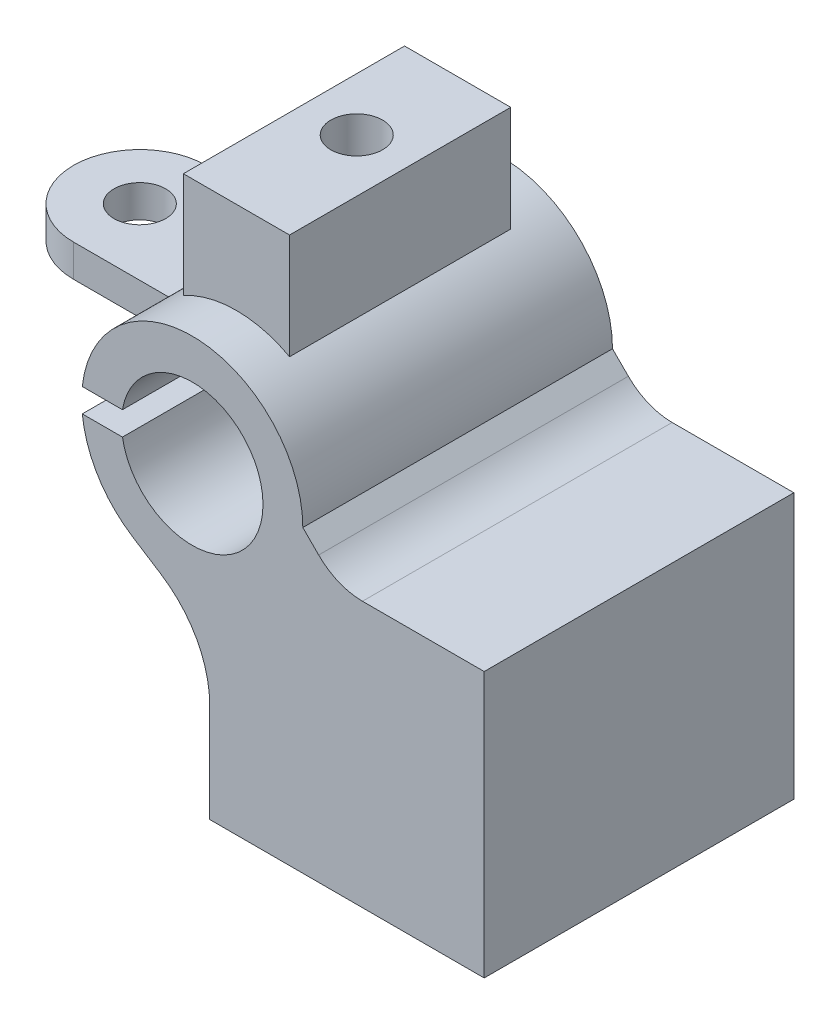
ISO-10303-21;
HEADER;
FILE_DESCRIPTION(('STEP AP214'),'2;1');
FILE_NAME('part.step','',(''),(''),'','','');
FILE_SCHEMA(('AUTOMOTIVE_DESIGN { 1 0 10303 214 1 1 1 1 }'));
ENDSEC;
DATA;
#1=APPLICATION_CONTEXT('core data for automotive mechanical design processes');
#2=APPLICATION_PROTOCOL_DEFINITION('international standard','automotive_design',2000,#1);
#3=PRODUCT_CONTEXT('',#1,'mechanical');
#4=PRODUCT('Part','Part','',(#3));
#5=PRODUCT_RELATED_PRODUCT_CATEGORY('part','',(#4));
#6=PRODUCT_DEFINITION_FORMATION('','',#4);
#7=PRODUCT_DEFINITION_CONTEXT('part definition',#1,'design');
#8=PRODUCT_DEFINITION('design','',#6,#7);
#9=PRODUCT_DEFINITION_SHAPE('','',#8);
#10=(LENGTH_UNIT() NAMED_UNIT(*) SI_UNIT(.MILLI.,.METRE.));
#11=(NAMED_UNIT(*) PLANE_ANGLE_UNIT() SI_UNIT($,.RADIAN.));
#12=(NAMED_UNIT(*) SI_UNIT($,.STERADIAN.) SOLID_ANGLE_UNIT());
#13=UNCERTAINTY_MEASURE_WITH_UNIT(LENGTH_MEASURE(1.E-05),#10,'distance_accuracy_value','');
#14=(GEOMETRIC_REPRESENTATION_CONTEXT(3) GLOBAL_UNCERTAINTY_ASSIGNED_CONTEXT((#13)) GLOBAL_UNIT_ASSIGNED_CONTEXT((#10,
#11,#12)) REPRESENTATION_CONTEXT('',''));
#15=CARTESIAN_POINT('',(0.,0.,0.));
#16=DIRECTION('',(0.,0.,1.));
#17=DIRECTION('',(1.,0.,0.));
#18=AXIS2_PLACEMENT_3D('',#15,#16,#17);
#19=CARTESIAN_POINT('',(-23.4236675195478,4.98706962256978,0.));
#20=DIRECTION('',(0.,1.,0.));
#21=DIRECTION('',(0.,0.,1.));
#22=AXIS2_PLACEMENT_3D('',#19,#20,#21);
#23=CYLINDRICAL_SURFACE('',#22,7.5);
#24=DIRECTION('',(0.,1.,0.));
#25=VECTOR('',#24,1.);
#26=CARTESIAN_POINT('',(-23.4236675195478,0.,7.5));
#27=LINE('',#26,#25);
#28=CARTESIAN_POINT('',(-23.4236675195478,4.98706962256978,7.5));
#29=VERTEX_POINT('',#28);
#30=CARTESIAN_POINT('',(-23.4236675195478,1.33882947838515,7.5));
#31=VERTEX_POINT('',#30);
#32=EDGE_CURVE('E108',#29,#31,#27,.F.);
#33=ORIENTED_EDGE('',*,*,#32,.F.);
#34=CARTESIAN_POINT('',(-23.4236675195478,4.98706962256978,0.));
#35=DIRECTION('',(0.,1.,0.));
#36=DIRECTION('',(0.,0.,1.));
#37=AXIS2_PLACEMENT_3D('',#34,#35,#36);
#38=CIRCLE('',#37,7.5);
#39=CARTESIAN_POINT('',(-23.4236675195478,4.98706962256978,-7.5));
#40=VERTEX_POINT('',#39);
#41=EDGE_CURVE('E59',#40,#29,#38,.T.);
#42=ORIENTED_EDGE('',*,*,#41,.F.);
#43=DIRECTION('',(0.,-1.,0.));
#44=VECTOR('',#43,1.);
#45=CARTESIAN_POINT('',(-23.4236675195478,4.98706962256978,-7.5));
#46=LINE('',#45,#44);
#47=CARTESIAN_POINT('',(-23.4236675195478,1.33882947838515,-7.5));
#48=VERTEX_POINT('',#47);
#49=EDGE_CURVE('E126',#48,#40,#46,.F.);
#50=ORIENTED_EDGE('',*,*,#49,.F.);
#51=CARTESIAN_POINT('',(-23.4236675195478,1.33882947838515,0.));
#52=DIRECTION('',(0.,-1.,0.));
#53=DIRECTION('',(0.,0.,-1.));
#54=AXIS2_PLACEMENT_3D('',#51,#52,#53);
#55=CIRCLE('',#54,7.5);
#56=EDGE_CURVE('E12',#31,#48,#55,.T.);
#57=ORIENTED_EDGE('',*,*,#56,.F.);
#58=EDGE_LOOP('',(#33,#42,#50,#57));
#59=FACE_BOUND('',#58,.T.);
#60=ADVANCED_FACE('F51',(#59),#23,.T.);
#61=CARTESIAN_POINT('',(0.,0.,7.5));
#62=DIRECTION('',(0.,0.,-1.));
#63=DIRECTION('',(-1.,0.,0.));
#64=AXIS2_PLACEMENT_3D('',#61,#62,#63);
#65=CYLINDRICAL_SURFACE('',#64,12.5);
#66=CARTESIAN_POINT('',(0.,0.,-7.5));
#67=DIRECTION('',(0.,0.,1.));
#68=DIRECTION('',(1.,0.,0.));
#69=AXIS2_PLACEMENT_3D('',#66,#67,#68);
#70=CIRCLE('',#69,12.5);
#71=CARTESIAN_POINT('',(-11.4620738341559,4.98706962256978,-7.5));
#72=VERTEX_POINT('',#71);
#73=CARTESIAN_POINT('',(-12.4280946097061,1.33882947838515,-7.5));
#74=VERTEX_POINT('',#73);
#75=EDGE_CURVE('E107',#72,#74,#70,.T.);
#76=ORIENTED_EDGE('',*,*,#75,.F.);
#77=DIRECTION('',(0.,0.,-1.));
#78=VECTOR('',#77,1.);
#79=CARTESIAN_POINT('',(-11.4620738341559,4.98706962256978,7.5));
#80=LINE('',#79,#78);
#81=CARTESIAN_POINT('',(-11.4620738341559,4.98706962256978,7.5));
#82=VERTEX_POINT('',#81);
#83=EDGE_CURVE('E94',#82,#72,#80,.T.);
#84=ORIENTED_EDGE('',*,*,#83,.F.);
#85=CARTESIAN_POINT('',(0.,0.,7.5));
#86=DIRECTION('',(0.,0.,1.));
#87=DIRECTION('',(1.,0.,0.));
#88=AXIS2_PLACEMENT_3D('',#85,#86,#87);
#89=CIRCLE('',#88,12.5);
#90=CARTESIAN_POINT('',(-12.4280946097061,1.33882947838515,7.5));
#91=VERTEX_POINT('',#90);
#92=EDGE_CURVE('E100',#82,#91,#89,.T.);
#93=ORIENTED_EDGE('',*,*,#92,.T.);
#94=DIRECTION('',(0.,0.,-1.));
#95=VECTOR('',#94,1.);
#96=CARTESIAN_POINT('',(-12.4280946097061,1.33882947838515,7.5));
#97=LINE('',#96,#95);
#98=EDGE_CURVE('E109',#91,#74,#97,.T.);
#99=ORIENTED_EDGE('',*,*,#98,.T.);
#100=EDGE_LOOP('',(#76,#84,#93,#99));
#101=FACE_BOUND('',#100,.T.);
#102=ADVANCED_FACE('F104',(#101),#65,.F.);
#103=CARTESIAN_POINT('',(0.,4.98706962256978,7.5));
#104=DIRECTION('',(0.,1.,0.));
#105=DIRECTION('',(0.,0.,1.));
#106=AXIS2_PLACEMENT_3D('',#103,#104,#105);
#107=PLANE('',#106);
#108=CARTESIAN_POINT('',(-23.4236675195478,4.98706962256978,0.));
#109=DIRECTION('',(0.,1.,0.));
#110=DIRECTION('',(0.,0.,1.));
#111=AXIS2_PLACEMENT_3D('',#108,#109,#110);
#112=CIRCLE('',#111,2.921);
#113=CARTESIAN_POINT('',(-23.4236675195478,4.98706962256978,2.921));
#114=VERTEX_POINT('',#113);
#115=EDGE_CURVE('E191',#114,#114,#112,.T.);
#116=ORIENTED_EDGE('',*,*,#115,.F.);
#117=EDGE_LOOP('',(#116));
#118=FACE_BOUND('',#117,.T.);
#119=DIRECTION('',(1.,0.,0.));
#120=VECTOR('',#119,1.);
#121=CARTESIAN_POINT('',(0.,4.98706962256978,-7.5));
#122=LINE('',#121,#120);
#123=EDGE_CURVE('E115',#40,#72,#122,.T.);
#124=ORIENTED_EDGE('',*,*,#123,.F.);
#125=ORIENTED_EDGE('',*,*,#41,.T.);
#126=DIRECTION('',(1.,0.,0.));
#127=VECTOR('',#126,1.);
#128=CARTESIAN_POINT('',(0.,4.98706962256978,7.5));
#129=LINE('',#128,#127);
#130=EDGE_CURVE('E90',#29,#82,#129,.T.);
#131=ORIENTED_EDGE('',*,*,#130,.T.);
#132=ORIENTED_EDGE('',*,*,#83,.T.);
#133=EDGE_LOOP('',(#124,#125,#131,#132));
#134=FACE_BOUND('',#133,.T.);
#135=ADVANCED_FACE('F93',(#118,#134),#107,.T.);
#136=CARTESIAN_POINT('',(0.,1.33882947838515,7.5));
#137=DIRECTION('',(0.,-1.,0.));
#138=DIRECTION('',(0.,0.,-1.));
#139=AXIS2_PLACEMENT_3D('',#136,#137,#138);
#140=PLANE('',#139);
#141=CARTESIAN_POINT('',(-23.4236675195478,1.33882947838515,0.));
#142=DIRECTION('',(0.,-1.,0.));
#143=DIRECTION('',(0.,0.,-1.));
#144=AXIS2_PLACEMENT_3D('',#141,#142,#143);
#145=CIRCLE('',#144,2.921);
#146=CARTESIAN_POINT('',(-23.4236675195478,1.33882947838515,-2.921));
#147=VERTEX_POINT('',#146);
#148=EDGE_CURVE('E118',#147,#147,#145,.T.);
#149=ORIENTED_EDGE('',*,*,#148,.F.);
#150=EDGE_LOOP('',(#149));
#151=FACE_BOUND('',#150,.T.);
#152=DIRECTION('',(-1.,0.,0.));
#153=VECTOR('',#152,1.);
#154=CARTESIAN_POINT('',(0.,1.33882947838515,7.5));
#155=LINE('',#154,#153);
#156=EDGE_CURVE('E99',#91,#31,#155,.T.);
#157=ORIENTED_EDGE('',*,*,#156,.T.);
#158=ORIENTED_EDGE('',*,*,#56,.T.);
#159=DIRECTION('',(-1.,0.,0.));
#160=VECTOR('',#159,1.);
#161=CARTESIAN_POINT('',(0.,1.33882947838515,-7.5));
#162=LINE('',#161,#160);
#163=EDGE_CURVE('E112',#74,#48,#162,.T.);
#164=ORIENTED_EDGE('',*,*,#163,.F.);
#165=ORIENTED_EDGE('',*,*,#98,.F.);
#166=EDGE_LOOP('',(#157,#158,#164,#165));
#167=FACE_BOUND('',#166,.T.);
#168=ADVANCED_FACE('F129',(#151,#167),#140,.T.);
#169=CARTESIAN_POINT('',(0.,0.,7.5));
#170=DIRECTION('',(0.,0.,1.));
#171=DIRECTION('',(1.,0.,0.));
#172=AXIS2_PLACEMENT_3D('',#169,#170,#171);
#173=PLANE('',#172);
#174=ORIENTED_EDGE('',*,*,#130,.F.);
#175=ORIENTED_EDGE('',*,*,#32,.T.);
#176=ORIENTED_EDGE('',*,*,#156,.F.);
#177=ORIENTED_EDGE('',*,*,#92,.F.);
#178=EDGE_LOOP('',(#174,#175,#176,#177));
#179=FACE_BOUND('',#178,.T.);
#180=ADVANCED_FACE('F111',(#179),#173,.T.);
#181=CARTESIAN_POINT('',(0.,0.,-7.5));
#182=DIRECTION('',(0.,0.,1.));
#183=DIRECTION('',(1.,0.,0.));
#184=AXIS2_PLACEMENT_3D('',#181,#182,#183);
#185=PLANE('',#184);
#186=ORIENTED_EDGE('',*,*,#163,.T.);
#187=ORIENTED_EDGE('',*,*,#49,.T.);
#188=ORIENTED_EDGE('',*,*,#123,.T.);
#189=ORIENTED_EDGE('',*,*,#75,.T.);
#190=EDGE_LOOP('',(#186,#187,#188,#189));
#191=FACE_BOUND('',#190,.T.);
#192=ADVANCED_FACE('F128',(#191),#185,.F.);
#193=CARTESIAN_POINT('',(-23.4236675195478,4.98706962256978,0.));
#194=DIRECTION('',(0.,1.,0.));
#195=DIRECTION('',(0.,0.,1.));
#196=AXIS2_PLACEMENT_3D('',#193,#194,#195);
#197=CYLINDRICAL_SURFACE('',#196,2.921);
#198=ORIENTED_EDGE('',*,*,#148,.T.);
#199=EDGE_LOOP('',(#198));
#200=FACE_BOUND('',#199,.T.);
#201=ORIENTED_EDGE('',*,*,#115,.T.);
#202=EDGE_LOOP('',(#201));
#203=FACE_BOUND('',#202,.T.);
#204=ADVANCED_FACE('F167',(#200,#203),#197,.F.);
#205=CLOSED_SHELL('',(#60,#102,#135,#168,#180,#192,#204));
#206=MANIFOLD_SOLID_BREP('B2',#205);
#207=CARTESIAN_POINT('',(-10.0222889013325,-22.6745266772196,17.5));
#208=DIRECTION('',(0.,0.,-1.));
#209=DIRECTION('',(-1.,0.,0.));
#210=AXIS2_PLACEMENT_3D('',#207,#208,#209);
#211=CYLINDRICAL_SURFACE('',#210,12.);
#212=CARTESIAN_POINT('',(-10.0222889013325,-22.6745266772196,-17.5));
#213=DIRECTION('',(0.,0.,1.));
#214=DIRECTION('',(1.,0.,0.));
#215=AXIS2_PLACEMENT_3D('',#212,#213,#214);
#216=CIRCLE('',#215,12.);
#217=CARTESIAN_POINT('',(1.97771109866749,-22.6745266772197,-17.5));
#218=VERTEX_POINT('',#217);
#219=CARTESIAN_POINT('',(-3.55188890133251,-12.5683936957079,-17.5));
#220=VERTEX_POINT('',#219);
#221=EDGE_CURVE('E359',#218,#220,#216,.T.);
#222=ORIENTED_EDGE('',*,*,#221,.F.);
#223=DIRECTION('',(0.,0.,-1.));
#224=VECTOR('',#223,1.);
#225=CARTESIAN_POINT('',(1.97771109866749,-22.6745266772197,17.5));
#226=LINE('',#225,#224);
#227=CARTESIAN_POINT('',(1.97771109866749,-22.6745266772197,17.5));
#228=VERTEX_POINT('',#227);
#229=EDGE_CURVE('E49',#228,#218,#226,.T.);
#230=ORIENTED_EDGE('',*,*,#229,.F.);
#231=CARTESIAN_POINT('',(-10.0222889013325,-22.6745266772196,17.5));
#232=DIRECTION('',(0.,0.,1.));
#233=DIRECTION('',(1.,0.,0.));
#234=AXIS2_PLACEMENT_3D('',#231,#232,#233);
#235=CIRCLE('',#234,12.);
#236=CARTESIAN_POINT('',(-3.55188890133251,-12.5683936957079,17.5));
#237=VERTEX_POINT('',#236);
#238=EDGE_CURVE('E360',#228,#237,#235,.T.);
#239=ORIENTED_EDGE('',*,*,#238,.T.);
#240=DIRECTION('',(0.,0.,-1.));
#241=VECTOR('',#240,1.);
#242=CARTESIAN_POINT('',(-3.55188890133251,-12.5683936957079,17.5));
#243=LINE('',#242,#241);
#244=EDGE_CURVE('E396',#237,#220,#243,.T.);
#245=ORIENTED_EDGE('',*,*,#244,.T.);
#246=EDGE_LOOP('',(#222,#230,#239,#245));
#247=FACE_BOUND('',#246,.T.);
#248=ADVANCED_FACE('F199',(#247),#211,.F.);
#249=CARTESIAN_POINT('',(1.97771109866756,0.,17.5));
#250=DIRECTION('',(-1.,0.,0.));
#251=DIRECTION('',(0.,-1.,0.));
#252=AXIS2_PLACEMENT_3D('',#249,#250,#251);
#253=PLANE('',#252);
#254=DIRECTION('',(0.,1.,0.));
#255=VECTOR('',#254,1.);
#256=CARTESIAN_POINT('',(1.97771109866756,0.,-17.5));
#257=LINE('',#256,#255);
#258=CARTESIAN_POINT('',(1.97771109866745,-33.8433027395554,-17.5));
#259=VERTEX_POINT('',#258);
#260=EDGE_CURVE('E399',#259,#218,#257,.T.);
#261=ORIENTED_EDGE('',*,*,#260,.F.);
#262=DIRECTION('',(0.,0.,-1.));
#263=VECTOR('',#262,1.);
#264=CARTESIAN_POINT('',(1.97771109866745,-33.8433027395554,17.5));
#265=LINE('',#264,#263);
#266=CARTESIAN_POINT('',(1.97771109866745,-33.8433027395554,17.5));
#267=VERTEX_POINT('',#266);
#268=EDGE_CURVE('E206',#267,#259,#265,.T.);
#269=ORIENTED_EDGE('',*,*,#268,.F.);
#270=DIRECTION('',(0.,1.,0.));
#271=VECTOR('',#270,1.);
#272=CARTESIAN_POINT('',(1.97771109866756,0.,17.5));
#273=LINE('',#272,#271);
#274=EDGE_CURVE('E363',#267,#228,#273,.T.);
#275=ORIENTED_EDGE('',*,*,#274,.T.);
#276=ORIENTED_EDGE('',*,*,#229,.T.);
#277=EDGE_LOOP('',(#261,#269,#275,#276));
#278=FACE_BOUND('',#277,.T.);
#279=ADVANCED_FACE('F459',(#278),#253,.T.);
#280=CARTESIAN_POINT('',(0.,-33.8433027395554,17.5));
#281=DIRECTION('',(0.,-1.,0.));
#282=DIRECTION('',(1.,0.,0.));
#283=AXIS2_PLACEMENT_3D('',#280,#281,#282);
#284=PLANE('',#283);
#285=DIRECTION('',(-1.,0.,0.));
#286=VECTOR('',#285,1.);
#287=CARTESIAN_POINT('',(0.,-33.8433027395554,-17.5));
#288=LINE('',#287,#286);
#289=CARTESIAN_POINT('',(33.,-33.8433027395554,-17.5));
#290=VERTEX_POINT('',#289);
#291=EDGE_CURVE('E402',#290,#259,#288,.T.);
#292=ORIENTED_EDGE('',*,*,#291,.F.);
#293=DIRECTION('',(0.,0.,-1.));
#294=VECTOR('',#293,1.);
#295=CARTESIAN_POINT('',(33.,-33.8433027395554,17.5));
#296=LINE('',#295,#294);
#297=CARTESIAN_POINT('',(33.,-33.8433027395554,17.5));
#298=VERTEX_POINT('',#297);
#299=EDGE_CURVE('E451',#298,#290,#296,.T.);
#300=ORIENTED_EDGE('',*,*,#299,.F.);
#301=DIRECTION('',(-1.,0.,0.));
#302=VECTOR('',#301,1.);
#303=CARTESIAN_POINT('',(0.,-33.8433027395554,17.5));
#304=LINE('',#303,#302);
#305=EDGE_CURVE('E367',#298,#267,#304,.T.);
#306=ORIENTED_EDGE('',*,*,#305,.T.);
#307=ORIENTED_EDGE('',*,*,#268,.T.);
#308=EDGE_LOOP('',(#292,#300,#306,#307));
#309=FACE_BOUND('',#308,.T.);
#310=ADVANCED_FACE('F455',(#309),#284,.T.);
#311=CARTESIAN_POINT('',(33.,0.,17.5));
#312=DIRECTION('',(1.,0.,0.));
#313=DIRECTION('',(0.,1.,0.));
#314=AXIS2_PLACEMENT_3D('',#311,#312,#313);
#315=PLANE('',#314);
#316=DIRECTION('',(0.,-1.,0.));
#317=VECTOR('',#316,1.);
#318=CARTESIAN_POINT('',(33.,0.,-17.5));
#319=LINE('',#318,#317);
#320=CARTESIAN_POINT('',(33.,-3.84330273955543,-17.5));
#321=VERTEX_POINT('',#320);
#322=EDGE_CURVE('E405',#321,#290,#319,.T.);
#323=ORIENTED_EDGE('',*,*,#322,.F.);
#324=DIRECTION('',(0.,0.,-1.));
#325=VECTOR('',#324,1.);
#326=CARTESIAN_POINT('',(33.,-3.84330273955543,17.5));
#327=LINE('',#326,#325);
#328=CARTESIAN_POINT('',(33.,-3.84330273955543,17.5));
#329=VERTEX_POINT('',#328);
#330=EDGE_CURVE('E449',#329,#321,#327,.T.);
#331=ORIENTED_EDGE('',*,*,#330,.F.);
#332=DIRECTION('',(0.,-1.,0.));
#333=VECTOR('',#332,1.);
#334=CARTESIAN_POINT('',(33.,0.,17.5));
#335=LINE('',#334,#333);
#336=EDGE_CURVE('E370',#329,#298,#335,.T.);
#337=ORIENTED_EDGE('',*,*,#336,.T.);
#338=ORIENTED_EDGE('',*,*,#299,.T.);
#339=EDGE_LOOP('',(#323,#331,#337,#338));
#340=FACE_BOUND('',#339,.T.);
#341=ADVANCED_FACE('F466',(#340),#315,.T.);
#342=CARTESIAN_POINT('',(0.,-3.84330273955544,17.5));
#343=DIRECTION('',(0.,1.,0.));
#344=DIRECTION('',(-1.,0.,0.));
#345=AXIS2_PLACEMENT_3D('',#342,#343,#344);
#346=PLANE('',#345);
#347=DIRECTION('',(1.,0.,0.));
#348=VECTOR('',#347,1.);
#349=CARTESIAN_POINT('',(0.,-3.84330273955544,-17.5));
#350=LINE('',#349,#348);
#351=CARTESIAN_POINT('',(19.2427976761671,-3.84330273955543,-17.5));
#352=VERTEX_POINT('',#351);
#353=EDGE_CURVE('E408',#352,#321,#350,.T.);
#354=ORIENTED_EDGE('',*,*,#353,.F.);
#355=DIRECTION('',(0.,0.,-1.));
#356=VECTOR('',#355,1.);
#357=CARTESIAN_POINT('',(19.2427976761671,-3.84330273955543,17.5));
#358=LINE('',#357,#356);
#359=CARTESIAN_POINT('',(19.2427976761671,-3.84330273955543,17.5));
#360=VERTEX_POINT('',#359);
#361=EDGE_CURVE('E447',#360,#352,#358,.T.);
#362=ORIENTED_EDGE('',*,*,#361,.F.);
#363=DIRECTION('',(1.,0.,0.));
#364=VECTOR('',#363,1.);
#365=CARTESIAN_POINT('',(0.,-3.84330273955544,17.5));
#366=LINE('',#365,#364);
#367=EDGE_CURVE('E373',#360,#329,#366,.T.);
#368=ORIENTED_EDGE('',*,*,#367,.T.);
#369=ORIENTED_EDGE('',*,*,#330,.T.);
#370=EDGE_LOOP('',(#354,#362,#368,#369));
#371=FACE_BOUND('',#370,.T.);
#372=ADVANCED_FACE('F508',(#371),#346,.T.);
#373=CARTESIAN_POINT('',(19.2427976761671,3.15669726044457,17.5));
#374=DIRECTION('',(0.,0.,-1.));
#375=DIRECTION('',(-1.,0.,0.));
#376=AXIS2_PLACEMENT_3D('',#373,#374,#375);
#377=CYLINDRICAL_SURFACE('',#376,7.);
#378=CARTESIAN_POINT('',(19.2427976761671,3.15669726044457,-17.5));
#379=DIRECTION('',(0.,0.,1.));
#380=DIRECTION('',(1.,0.,0.));
#381=AXIS2_PLACEMENT_3D('',#378,#379,#380);
#382=CIRCLE('',#381,7.);
#383=CARTESIAN_POINT('',(14.2930502078613,-1.79305020786126,-17.5));
#384=VERTEX_POINT('',#383);
#385=EDGE_CURVE('E411',#384,#352,#382,.T.);
#386=ORIENTED_EDGE('',*,*,#385,.F.);
#387=DIRECTION('',(0.,0.,-1.));
#388=VECTOR('',#387,1.);
#389=CARTESIAN_POINT('',(14.2930502078613,-1.79305020786126,17.5));
#390=LINE('',#389,#388);
#391=CARTESIAN_POINT('',(14.2930502078613,-1.79305020786126,17.5));
#392=VERTEX_POINT('',#391);
#393=EDGE_CURVE('E445',#392,#384,#390,.T.);
#394=ORIENTED_EDGE('',*,*,#393,.F.);
#395=CARTESIAN_POINT('',(19.2427976761671,3.15669726044457,17.5));
#396=DIRECTION('',(0.,0.,1.));
#397=DIRECTION('',(1.,0.,0.));
#398=AXIS2_PLACEMENT_3D('',#395,#396,#397);
#399=CIRCLE('',#398,7.);
#400=EDGE_CURVE('E376',#392,#360,#399,.T.);
#401=ORIENTED_EDGE('',*,*,#400,.T.);
#402=ORIENTED_EDGE('',*,*,#361,.T.);
#403=EDGE_LOOP('',(#386,#394,#401,#402));
#404=FACE_BOUND('',#403,.T.);
#405=ADVANCED_FACE('F506',(#404),#377,.F.);
#406=CARTESIAN_POINT('',(6.25,6.25,17.5));
#407=DIRECTION('',(0.707106781186548,0.707106781186548,0.));
#408=DIRECTION('',(-0.707106781186548,0.707106781186548,0.));
#409=AXIS2_PLACEMENT_3D('',#406,#407,#408);
#410=PLANE('',#409);
#411=DIRECTION('',(0.707106781186548,-0.707106781186548,0.));
#412=VECTOR('',#411,1.);
#413=CARTESIAN_POINT('',(6.25,6.25,-17.5));
#414=LINE('',#413,#412);
#415=CARTESIAN_POINT('',(12.5,0.,-17.5));
#416=VERTEX_POINT('',#415);
#417=EDGE_CURVE('E414',#416,#384,#414,.T.);
#418=ORIENTED_EDGE('',*,*,#417,.F.);
#419=DIRECTION('',(0.,0.,-1.));
#420=VECTOR('',#419,1.);
#421=CARTESIAN_POINT('',(12.5,0.,17.5));
#422=LINE('',#421,#420);
#423=CARTESIAN_POINT('',(12.5,0.,17.5));
#424=VERTEX_POINT('',#423);
#425=EDGE_CURVE('E443',#424,#416,#422,.T.);
#426=ORIENTED_EDGE('',*,*,#425,.F.);
#427=DIRECTION('',(0.707106781186548,-0.707106781186548,0.));
#428=VECTOR('',#427,1.);
#429=CARTESIAN_POINT('',(6.25,6.25,17.5));
#430=LINE('',#429,#428);
#431=EDGE_CURVE('E379',#424,#392,#430,.T.);
#432=ORIENTED_EDGE('',*,*,#431,.T.);
#433=ORIENTED_EDGE('',*,*,#393,.T.);
#434=EDGE_LOOP('',(#418,#426,#432,#433));
#435=FACE_BOUND('',#434,.T.);
#436=ADVANCED_FACE('F500',(#435),#410,.T.);
#437=CARTESIAN_POINT('',(0.,0.,17.5));
#438=DIRECTION('',(0.,0.,-1.));
#439=DIRECTION('',(-1.,0.,0.));
#440=AXIS2_PLACEMENT_3D('',#437,#438,#439);
#441=CYLINDRICAL_SURFACE('',#440,12.5);
#442=DIRECTION('',(0.,0.,-1.));
#443=VECTOR('',#442,1.);
#444=CARTESIAN_POINT('',(6.,10.9658560997307,12.5));
#445=LINE('',#444,#443);
#446=CARTESIAN_POINT('',(6.,10.9658560997307,12.5));
#447=VERTEX_POINT('',#446);
#448=CARTESIAN_POINT('',(6.,10.9658560997307,-12.5));
#449=VERTEX_POINT('',#448);
#450=EDGE_CURVE('E213',#447,#449,#445,.T.);
#451=ORIENTED_EDGE('',*,*,#450,.F.);
#452=CARTESIAN_POINT('',(0.,0.,12.5));
#453=DIRECTION('',(0.,0.,1.));
#454=DIRECTION('',(1.,0.,0.));
#455=AXIS2_PLACEMENT_3D('',#452,#453,#454);
#456=CIRCLE('',#455,12.5);
#457=CARTESIAN_POINT('',(-6.,10.9658560997307,12.5));
#458=VERTEX_POINT('',#457);
#459=EDGE_CURVE('E217',#447,#458,#456,.T.);
#460=ORIENTED_EDGE('',*,*,#459,.T.);
#461=DIRECTION('',(0.,0.,-1.));
#462=VECTOR('',#461,1.);
#463=CARTESIAN_POINT('',(-6.,10.9658560997307,12.5));
#464=LINE('',#463,#462);
#465=CARTESIAN_POINT('',(-6.,10.9658560997307,-12.5));
#466=VERTEX_POINT('',#465);
#467=EDGE_CURVE('E344',#458,#466,#464,.T.);
#468=ORIENTED_EDGE('',*,*,#467,.T.);
#469=CARTESIAN_POINT('',(0.,0.,-12.5));
#470=DIRECTION('',(0.,0.,1.));
#471=DIRECTION('',(1.,0.,0.));
#472=AXIS2_PLACEMENT_3D('',#469,#470,#471);
#473=CIRCLE('',#472,12.5);
#474=EDGE_CURVE('E325',#449,#466,#473,.T.);
#475=ORIENTED_EDGE('',*,*,#474,.F.);
#476=EDGE_LOOP('',(#451,#460,#468,#475));
#477=FACE_BOUND('',#476,.T.);
#478=CARTESIAN_POINT('',(0.,0.,-17.5));
#479=DIRECTION('',(0.,0.,1.));
#480=DIRECTION('',(1.,0.,0.));
#481=AXIS2_PLACEMENT_3D('',#478,#479,#480);
#482=CIRCLE('',#481,12.5);
#483=CARTESIAN_POINT('',(-12.4280946097061,1.33882947838515,-17.5));
#484=VERTEX_POINT('',#483);
#485=EDGE_CURVE('E417',#416,#484,#482,.T.);
#486=ORIENTED_EDGE('',*,*,#485,.T.);
#487=DIRECTION('',(0.,0.,-1.));
#488=VECTOR('',#487,1.);
#489=CARTESIAN_POINT('',(-12.4280946097061,1.33882947838515,17.5));
#490=LINE('',#489,#488);
#491=CARTESIAN_POINT('',(-12.4280946097061,1.33882947838515,17.5));
#492=VERTEX_POINT('',#491);
#493=EDGE_CURVE('E441',#492,#484,#490,.T.);
#494=ORIENTED_EDGE('',*,*,#493,.F.);
#495=CARTESIAN_POINT('',(0.,0.,17.5));
#496=DIRECTION('',(0.,0.,1.));
#497=DIRECTION('',(1.,0.,0.));
#498=AXIS2_PLACEMENT_3D('',#495,#496,#497);
#499=CIRCLE('',#498,12.5);
#500=EDGE_CURVE('E382',#424,#492,#499,.T.);
#501=ORIENTED_EDGE('',*,*,#500,.F.);
#502=ORIENTED_EDGE('',*,*,#425,.T.);
#503=EDGE_LOOP('',(#486,#494,#501,#502));
#504=FACE_BOUND('',#503,.T.);
#505=ADVANCED_FACE('F509',(#477,#504),#441,.T.);
#506=CARTESIAN_POINT('',(0.,1.33882947838515,17.5));
#507=DIRECTION('',(0.,-1.,0.));
#508=DIRECTION('',(1.,0.,0.));
#509=AXIS2_PLACEMENT_3D('',#506,#507,#508);
#510=PLANE('',#509);
#511=DIRECTION('',(-1.,0.,0.));
#512=VECTOR('',#511,1.);
#513=CARTESIAN_POINT('',(0.,1.33882947838515,-17.5));
#514=LINE('',#513,#512);
#515=CARTESIAN_POINT('',(-7.88717538969477,1.33882947838515,-17.5));
#516=VERTEX_POINT('',#515);
#517=EDGE_CURVE('E420',#516,#484,#514,.T.);
#518=ORIENTED_EDGE('',*,*,#517,.F.);
#519=DIRECTION('',(0.,0.,-1.));
#520=VECTOR('',#519,1.);
#521=CARTESIAN_POINT('',(-7.88717538969477,1.33882947838515,17.5));
#522=LINE('',#521,#520);
#523=CARTESIAN_POINT('',(-7.88717538969477,1.33882947838515,17.5));
#524=VERTEX_POINT('',#523);
#525=EDGE_CURVE('E439',#524,#516,#522,.T.);
#526=ORIENTED_EDGE('',*,*,#525,.F.);
#527=DIRECTION('',(-1.,0.,0.));
#528=VECTOR('',#527,1.);
#529=CARTESIAN_POINT('',(0.,1.33882947838515,17.5));
#530=LINE('',#529,#528);
#531=EDGE_CURVE('E384',#524,#492,#530,.T.);
#532=ORIENTED_EDGE('',*,*,#531,.T.);
#533=ORIENTED_EDGE('',*,*,#493,.T.);
#534=EDGE_LOOP('',(#518,#526,#532,#533));
#535=FACE_BOUND('',#534,.T.);
#536=ADVANCED_FACE('F494',(#535),#510,.T.);
#537=CARTESIAN_POINT('',(0.,0.,17.5));
#538=DIRECTION('',(0.,0.,-1.));
#539=DIRECTION('',(-1.,0.,0.));
#540=AXIS2_PLACEMENT_3D('',#537,#538,#539);
#541=CYLINDRICAL_SURFACE('',#540,8.);
#542=CARTESIAN_POINT('',(0.,0.,-17.5));
#543=DIRECTION('',(0.,0.,1.));
#544=DIRECTION('',(1.,0.,0.));
#545=AXIS2_PLACEMENT_3D('',#542,#543,#544);
#546=CIRCLE('',#545,8.);
#547=CARTESIAN_POINT('',(-7.88717538969477,-1.33882947838515,-17.5));
#548=VERTEX_POINT('',#547);
#549=EDGE_CURVE('E424',#548,#516,#546,.T.);
#550=ORIENTED_EDGE('',*,*,#549,.F.);
#551=DIRECTION('',(0.,0.,-1.));
#552=VECTOR('',#551,1.);
#553=CARTESIAN_POINT('',(-7.88717538969477,-1.33882947838515,17.5));
#554=LINE('',#553,#552);
#555=CARTESIAN_POINT('',(-7.88717538969477,-1.33882947838515,17.5));
#556=VERTEX_POINT('',#555);
#557=EDGE_CURVE('E437',#556,#548,#554,.T.);
#558=ORIENTED_EDGE('',*,*,#557,.F.);
#559=CARTESIAN_POINT('',(0.,0.,17.5));
#560=DIRECTION('',(0.,0.,1.));
#561=DIRECTION('',(1.,0.,0.));
#562=AXIS2_PLACEMENT_3D('',#559,#560,#561);
#563=CIRCLE('',#562,8.);
#564=EDGE_CURVE('E388',#556,#524,#563,.T.);
#565=ORIENTED_EDGE('',*,*,#564,.T.);
#566=ORIENTED_EDGE('',*,*,#525,.T.);
#567=EDGE_LOOP('',(#550,#558,#565,#566));
#568=FACE_BOUND('',#567,.T.);
#569=ADVANCED_FACE('F488',(#568),#541,.F.);
#570=CARTESIAN_POINT('',(0.,-1.33882947838515,17.5));
#571=DIRECTION('',(0.,-1.,0.));
#572=DIRECTION('',(1.,0.,0.));
#573=AXIS2_PLACEMENT_3D('',#570,#571,#572);
#574=PLANE('',#573);
#575=DIRECTION('',(-1.,0.,0.));
#576=VECTOR('',#575,1.);
#577=CARTESIAN_POINT('',(0.,-1.33882947838515,-17.5));
#578=LINE('',#577,#576);
#579=CARTESIAN_POINT('',(-12.4280946097061,-1.33882947838515,-17.5));
#580=VERTEX_POINT('',#579);
#581=EDGE_CURVE('E427',#548,#580,#578,.T.);
#582=ORIENTED_EDGE('',*,*,#581,.T.);
#583=DIRECTION('',(0.,0.,-1.));
#584=VECTOR('',#583,1.);
#585=CARTESIAN_POINT('',(-12.4280946097061,-1.33882947838515,17.5));
#586=LINE('',#585,#584);
#587=CARTESIAN_POINT('',(-12.4280946097061,-1.33882947838515,17.5));
#588=VERTEX_POINT('',#587);
#589=EDGE_CURVE('E434',#588,#580,#586,.T.);
#590=ORIENTED_EDGE('',*,*,#589,.F.);
#591=DIRECTION('',(-1.,0.,0.));
#592=VECTOR('',#591,1.);
#593=CARTESIAN_POINT('',(0.,-1.33882947838515,17.5));
#594=LINE('',#593,#592);
#595=EDGE_CURVE('E391',#556,#588,#594,.T.);
#596=ORIENTED_EDGE('',*,*,#595,.F.);
#597=ORIENTED_EDGE('',*,*,#557,.T.);
#598=EDGE_LOOP('',(#582,#590,#596,#597));
#599=FACE_BOUND('',#598,.T.);
#600=ADVANCED_FACE('F521',(#599),#574,.F.);
#601=CARTESIAN_POINT('',(-6.74,-10.5272218557414,-17.5));
#602=VERTEX_POINT('',#601);
#603=EDGE_CURVE('E421',#580,#602,#482,.T.);
#604=ORIENTED_EDGE('',*,*,#603,.T.);
#605=DIRECTION('',(0.,0.,-1.));
#606=VECTOR('',#605,1.);
#607=CARTESIAN_POINT('',(-6.74,-10.5272218557414,17.5));
#608=LINE('',#607,#606);
#609=CARTESIAN_POINT('',(-6.74,-10.5272218557414,17.5));
#610=VERTEX_POINT('',#609);
#611=EDGE_CURVE('E432',#610,#602,#608,.T.);
#612=ORIENTED_EDGE('',*,*,#611,.F.);
#613=EDGE_CURVE('E385',#588,#610,#499,.T.);
#614=ORIENTED_EDGE('',*,*,#613,.F.);
#615=ORIENTED_EDGE('',*,*,#589,.T.);
#616=EDGE_LOOP('',(#604,#612,#614,#615));
#617=FACE_BOUND('',#616,.T.);
#618=ADVANCED_FACE('F482',(#617),#441,.T.);
#619=CARTESIAN_POINT('',(-6.74,-10.5272218557414,17.5));
#620=DIRECTION('',(-0.5392,-0.842177748459314,0.));
#621=DIRECTION('',(0.842177748459314,-0.5392,0.));
#622=AXIS2_PLACEMENT_3D('',#619,#620,#621);
#623=PLANE('',#622);
#624=DIRECTION('',(-0.842177748459314,0.5392,0.));
#625=VECTOR('',#624,1.);
#626=CARTESIAN_POINT('',(-6.74,-10.5272218557414,-17.5));
#627=LINE('',#626,#625);
#628=EDGE_CURVE('E364',#220,#602,#627,.T.);
#629=ORIENTED_EDGE('',*,*,#628,.F.);
#630=ORIENTED_EDGE('',*,*,#244,.F.);
#631=DIRECTION('',(-0.842177748459314,0.5392,0.));
#632=VECTOR('',#631,1.);
#633=CARTESIAN_POINT('',(-6.74,-10.5272218557414,17.5));
#634=LINE('',#633,#632);
#635=EDGE_CURVE('E393',#237,#610,#634,.T.);
#636=ORIENTED_EDGE('',*,*,#635,.T.);
#637=ORIENTED_EDGE('',*,*,#611,.T.);
#638=EDGE_LOOP('',(#629,#630,#636,#637));
#639=FACE_BOUND('',#638,.T.);
#640=ADVANCED_FACE('F477',(#639),#623,.T.);
#641=CARTESIAN_POINT('',(0.,0.,17.5));
#642=DIRECTION('',(0.,0.,1.));
#643=DIRECTION('',(1.,0.,0.));
#644=AXIS2_PLACEMENT_3D('',#641,#642,#643);
#645=PLANE('',#644);
#646=ORIENTED_EDGE('',*,*,#238,.F.);
#647=ORIENTED_EDGE('',*,*,#274,.F.);
#648=ORIENTED_EDGE('',*,*,#305,.F.);
#649=ORIENTED_EDGE('',*,*,#336,.F.);
#650=ORIENTED_EDGE('',*,*,#367,.F.);
#651=ORIENTED_EDGE('',*,*,#400,.F.);
#652=ORIENTED_EDGE('',*,*,#431,.F.);
#653=ORIENTED_EDGE('',*,*,#500,.T.);
#654=ORIENTED_EDGE('',*,*,#531,.F.);
#655=ORIENTED_EDGE('',*,*,#564,.F.);
#656=ORIENTED_EDGE('',*,*,#595,.T.);
#657=ORIENTED_EDGE('',*,*,#613,.T.);
#658=ORIENTED_EDGE('',*,*,#635,.F.);
#659=EDGE_LOOP('',(#646,#647,#648,#649,#650,#651,#652,#653,#654,#655,#656,#657,#658));
#660=FACE_BOUND('',#659,.T.);
#661=ADVANCED_FACE('F470',(#660),#645,.T.);
#662=CARTESIAN_POINT('',(0.,0.,-17.5));
#663=DIRECTION('',(0.,0.,1.));
#664=DIRECTION('',(1.,0.,0.));
#665=AXIS2_PLACEMENT_3D('',#662,#663,#664);
#666=PLANE('',#665);
#667=ORIENTED_EDGE('',*,*,#221,.T.);
#668=ORIENTED_EDGE('',*,*,#628,.T.);
#669=ORIENTED_EDGE('',*,*,#603,.F.);
#670=ORIENTED_EDGE('',*,*,#581,.F.);
#671=ORIENTED_EDGE('',*,*,#549,.T.);
#672=ORIENTED_EDGE('',*,*,#517,.T.);
#673=ORIENTED_EDGE('',*,*,#485,.F.);
#674=ORIENTED_EDGE('',*,*,#417,.T.);
#675=ORIENTED_EDGE('',*,*,#385,.T.);
#676=ORIENTED_EDGE('',*,*,#353,.T.);
#677=ORIENTED_EDGE('',*,*,#322,.T.);
#678=ORIENTED_EDGE('',*,*,#291,.T.);
#679=ORIENTED_EDGE('',*,*,#260,.T.);
#680=EDGE_LOOP('',(#667,#668,#669,#670,#671,#672,#673,#674,#675,#676,#677,#678,#679));
#681=FACE_BOUND('',#680,.T.);
#682=ADVANCED_FACE('F462',(#681),#666,.F.);
#683=CARTESIAN_POINT('',(5.99999999999999,0.,12.5));
#684=DIRECTION('',(1.,0.,0.));
#685=DIRECTION('',(0.,1.,0.));
#686=AXIS2_PLACEMENT_3D('',#683,#684,#685);
#687=PLANE('',#686);
#688=DIRECTION('',(0.,-1.,0.));
#689=VECTOR('',#688,1.);
#690=CARTESIAN_POINT('',(5.99999999999999,0.,-12.5));
#691=LINE('',#690,#689);
#692=CARTESIAN_POINT('',(6.,22.8852094702535,-12.5));
#693=VERTEX_POINT('',#692);
#694=EDGE_CURVE('E329',#693,#449,#691,.T.);
#695=ORIENTED_EDGE('',*,*,#694,.F.);
#696=DIRECTION('',(0.,0.,-1.));
#697=VECTOR('',#696,1.);
#698=CARTESIAN_POINT('',(6.,22.8852094702535,12.5));
#699=LINE('',#698,#697);
#700=CARTESIAN_POINT('',(6.,22.8852094702535,12.5));
#701=VERTEX_POINT('',#700);
#702=EDGE_CURVE('E356',#701,#693,#699,.T.);
#703=ORIENTED_EDGE('',*,*,#702,.F.);
#704=DIRECTION('',(0.,-1.,0.));
#705=VECTOR('',#704,1.);
#706=CARTESIAN_POINT('',(5.99999999999999,0.,12.5));
#707=LINE('',#706,#705);
#708=EDGE_CURVE('E335',#701,#447,#707,.T.);
#709=ORIENTED_EDGE('',*,*,#708,.T.);
#710=ORIENTED_EDGE('',*,*,#450,.T.);
#711=EDGE_LOOP('',(#695,#703,#709,#710));
#712=FACE_BOUND('',#711,.T.);
#713=ADVANCED_FACE('F564',(#712),#687,.T.);
#714=CARTESIAN_POINT('',(0.,22.8852094702535,12.5));
#715=DIRECTION('',(0.,1.,0.));
#716=DIRECTION('',(0.,0.,1.));
#717=AXIS2_PLACEMENT_3D('',#714,#715,#716);
#718=PLANE('',#717);
#719=CARTESIAN_POINT('',(0.,22.8852094702535,-1.09221992505582));
#720=DIRECTION('',(0.,1.,0.));
#721=DIRECTION('',(0.,0.,1.));
#722=AXIS2_PLACEMENT_3D('',#719,#720,#721);
#723=CIRCLE('',#722,2.921);
#724=CARTESIAN_POINT('',(0.,22.8852094702535,1.82878007494418));
#725=VERTEX_POINT('',#724);
#726=EDGE_CURVE('E326',#725,#725,#723,.T.);
#727=ORIENTED_EDGE('',*,*,#726,.F.);
#728=EDGE_LOOP('',(#727));
#729=FACE_BOUND('',#728,.T.);
#730=DIRECTION('',(1.,0.,0.));
#731=VECTOR('',#730,1.);
#732=CARTESIAN_POINT('',(0.,22.8852094702535,-12.5));
#733=LINE('',#732,#731);
#734=CARTESIAN_POINT('',(-6.,22.8852094702535,-12.5));
#735=VERTEX_POINT('',#734);
#736=EDGE_CURVE('E348',#735,#693,#733,.T.);
#737=ORIENTED_EDGE('',*,*,#736,.F.);
#738=DIRECTION('',(0.,0.,-1.));
#739=VECTOR('',#738,1.);
#740=CARTESIAN_POINT('',(-6.,22.8852094702535,12.5));
#741=LINE('',#740,#739);
#742=CARTESIAN_POINT('',(-6.,22.8852094702535,12.5));
#743=VERTEX_POINT('',#742);
#744=EDGE_CURVE('E354',#743,#735,#741,.T.);
#745=ORIENTED_EDGE('',*,*,#744,.F.);
#746=DIRECTION('',(1.,0.,0.));
#747=VECTOR('',#746,1.);
#748=CARTESIAN_POINT('',(0.,22.8852094702535,12.5));
#749=LINE('',#748,#747);
#750=EDGE_CURVE('E339',#743,#701,#749,.T.);
#751=ORIENTED_EDGE('',*,*,#750,.T.);
#752=ORIENTED_EDGE('',*,*,#702,.T.);
#753=EDGE_LOOP('',(#737,#745,#751,#752));
#754=FACE_BOUND('',#753,.T.);
#755=ADVANCED_FACE('F571',(#729,#754),#718,.T.);
#756=CARTESIAN_POINT('',(-5.99999999999999,0.,12.5));
#757=DIRECTION('',(-1.,0.,0.));
#758=DIRECTION('',(0.,-1.,0.));
#759=AXIS2_PLACEMENT_3D('',#756,#757,#758);
#760=PLANE('',#759);
#761=DIRECTION('',(0.,1.,0.));
#762=VECTOR('',#761,1.);
#763=CARTESIAN_POINT('',(-5.99999999999999,0.,-12.5));
#764=LINE('',#763,#762);
#765=EDGE_CURVE('E336',#466,#735,#764,.T.);
#766=ORIENTED_EDGE('',*,*,#765,.F.);
#767=ORIENTED_EDGE('',*,*,#467,.F.);
#768=DIRECTION('',(0.,1.,0.));
#769=VECTOR('',#768,1.);
#770=CARTESIAN_POINT('',(-5.99999999999999,0.,12.5));
#771=LINE('',#770,#769);
#772=EDGE_CURVE('E342',#458,#743,#771,.T.);
#773=ORIENTED_EDGE('',*,*,#772,.T.);
#774=ORIENTED_EDGE('',*,*,#744,.T.);
#775=EDGE_LOOP('',(#766,#767,#773,#774));
#776=FACE_BOUND('',#775,.T.);
#777=ADVANCED_FACE('F580',(#776),#760,.T.);
#778=CARTESIAN_POINT('',(0.,0.,12.5));
#779=DIRECTION('',(0.,0.,1.));
#780=DIRECTION('',(1.,0.,0.));
#781=AXIS2_PLACEMENT_3D('',#778,#779,#780);
#782=PLANE('',#781);
#783=ORIENTED_EDGE('',*,*,#459,.F.);
#784=ORIENTED_EDGE('',*,*,#708,.F.);
#785=ORIENTED_EDGE('',*,*,#750,.F.);
#786=ORIENTED_EDGE('',*,*,#772,.F.);
#787=EDGE_LOOP('',(#783,#784,#785,#786));
#788=FACE_BOUND('',#787,.T.);
#789=ADVANCED_FACE('F589',(#788),#782,.T.);
#790=CARTESIAN_POINT('',(0.,0.,-12.5));
#791=DIRECTION('',(0.,0.,1.));
#792=DIRECTION('',(1.,0.,0.));
#793=AXIS2_PLACEMENT_3D('',#790,#791,#792);
#794=PLANE('',#793);
#795=ORIENTED_EDGE('',*,*,#474,.T.);
#796=ORIENTED_EDGE('',*,*,#765,.T.);
#797=ORIENTED_EDGE('',*,*,#736,.T.);
#798=ORIENTED_EDGE('',*,*,#694,.T.);
#799=EDGE_LOOP('',(#795,#796,#797,#798));
#800=FACE_BOUND('',#799,.T.);
#801=ADVANCED_FACE('F319',(#800),#794,.F.);
#802=CARTESIAN_POINT('',(0.,12.8852094702535,-1.09221992505582));
#803=DIRECTION('',(0.,1.,0.));
#804=DIRECTION('',(0.,0.,1.));
#805=AXIS2_PLACEMENT_3D('',#802,#803,#804);
#806=CONICAL_SURFACE('',#805,2.921,1.02974425867665);
#807=CARTESIAN_POINT('',(0.,11.130095602074,-1.09221992505582));
#808=VERTEX_POINT('',#807);
#809=VERTEX_LOOP('',#808);
#810=FACE_BOUND('',#809,.T.);
#811=CARTESIAN_POINT('',(0.,12.8852094702535,-1.09221992505582));
#812=DIRECTION('',(0.,1.,0.));
#813=DIRECTION('',(0.,0.,1.));
#814=AXIS2_PLACEMENT_3D('',#811,#812,#813);
#815=CIRCLE('',#814,2.921);
#816=CARTESIAN_POINT('',(0.,12.8852094702535,1.82878007494418));
#817=VERTEX_POINT('',#816);
#818=EDGE_CURVE('E323',#817,#817,#815,.T.);
#819=ORIENTED_EDGE('',*,*,#818,.T.);
#820=EDGE_LOOP('',(#819));
#821=FACE_BOUND('',#820,.T.);
#822=ADVANCED_FACE('F315',(#810,#821),#806,.F.);
#823=CARTESIAN_POINT('',(0.,22.8852094702535,-1.09221992505582));
#824=DIRECTION('',(0.,1.,0.));
#825=DIRECTION('',(0.,0.,1.));
#826=AXIS2_PLACEMENT_3D('',#823,#824,#825);
#827=CYLINDRICAL_SURFACE('',#826,2.921);
#828=ORIENTED_EDGE('',*,*,#818,.F.);
#829=EDGE_LOOP('',(#828));
#830=FACE_BOUND('',#829,.T.);
#831=ORIENTED_EDGE('',*,*,#726,.T.);
#832=EDGE_LOOP('',(#831));
#833=FACE_BOUND('',#832,.T.);
#834=ADVANCED_FACE('F318',(#830,#833),#827,.F.);
#835=CLOSED_SHELL('',(#248,#279,#310,#341,#372,#405,#436,#505,#536,#569,#600,#618,#640,#661,
#682,#713,#755,#777,#789,#801,#822,#834));
#836=MANIFOLD_SOLID_BREP('B6',#835);
#837=ADVANCED_BREP_SHAPE_REPRESENTATION('',(#18,#206,#836),#14);
#838=SHAPE_DEFINITION_REPRESENTATION(#9,#837);
ENDSEC;
END-ISO-10303-21;
